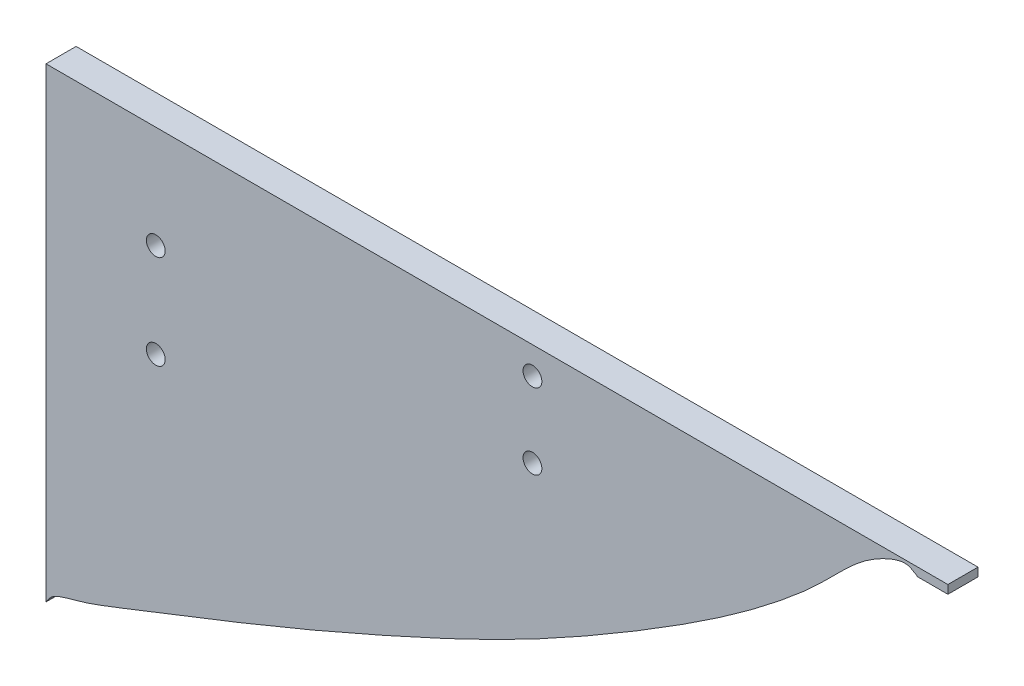
ISO-10303-21;
HEADER;
FILE_DESCRIPTION(('STEP AP214'),'2;1');
FILE_NAME('part.step','',(''),(''),'','','');
FILE_SCHEMA(('AUTOMOTIVE_DESIGN { 1 0 10303 214 1 1 1 1 }'));
ENDSEC;
DATA;
#1=APPLICATION_CONTEXT('core data for automotive mechanical design processes');
#2=APPLICATION_PROTOCOL_DEFINITION('international standard','automotive_design',2000,#1);
#3=PRODUCT_CONTEXT('',#1,'mechanical');
#4=PRODUCT('Part','Part','',(#3));
#5=PRODUCT_RELATED_PRODUCT_CATEGORY('part','',(#4));
#6=PRODUCT_DEFINITION_FORMATION('','',#4);
#7=PRODUCT_DEFINITION_CONTEXT('part definition',#1,'design');
#8=PRODUCT_DEFINITION('design','',#6,#7);
#9=PRODUCT_DEFINITION_SHAPE('','',#8);
#10=(LENGTH_UNIT() NAMED_UNIT(*) SI_UNIT(.MILLI.,.METRE.));
#11=(NAMED_UNIT(*) PLANE_ANGLE_UNIT() SI_UNIT($,.RADIAN.));
#12=(NAMED_UNIT(*) SI_UNIT($,.STERADIAN.) SOLID_ANGLE_UNIT());
#13=UNCERTAINTY_MEASURE_WITH_UNIT(LENGTH_MEASURE(1.E-05),#10,'distance_accuracy_value','');
#14=(GEOMETRIC_REPRESENTATION_CONTEXT(3) GLOBAL_UNCERTAINTY_ASSIGNED_CONTEXT((#13)) GLOBAL_UNIT_ASSIGNED_CONTEXT((#10,
#11,#12)) REPRESENTATION_CONTEXT('',''));
#15=CARTESIAN_POINT('',(0.,0.,0.));
#16=DIRECTION('',(0.,0.,1.));
#17=DIRECTION('',(1.,0.,0.));
#18=AXIS2_PLACEMENT_3D('',#15,#16,#17);
#19=CARTESIAN_POINT('',(-7.70807138526175,-69.5026230375403,128.));
#20=DIRECTION('',(0.,0.,1.));
#21=DIRECTION('',(1.,0.,0.));
#22=AXIS2_PLACEMENT_3D('',#19,#20,#21);
#23=PLANE('',#22);
#24=CARTESIAN_POINT('',(-100.,-50.,128.));
#25=DIRECTION('',(0.,0.,1.));
#26=DIRECTION('',(1.,0.,0.));
#27=AXIS2_PLACEMENT_3D('',#24,#25,#26);
#28=CIRCLE('',#27,2.5);
#29=CARTESIAN_POINT('',(-97.5,-50.,128.));
#30=VERTEX_POINT('',#29);
#31=EDGE_CURVE('E167',#30,#30,#28,.F.);
#32=ORIENTED_EDGE('',*,*,#31,.T.);
#33=EDGE_LOOP('',(#32));
#34=FACE_BOUND('',#33,.T.);
#35=CARTESIAN_POINT('',(0.0705666698621599,-4.96037406111782,128.));
#36=DIRECTION('',(0.,0.,1.));
#37=DIRECTION('',(1.,0.,0.));
#38=AXIS2_PLACEMENT_3D('',#35,#36,#37);
#39=CIRCLE('',#38,2.5);
#40=CARTESIAN_POINT('',(2.57056666986216,-4.96037406111782,128.));
#41=VERTEX_POINT('',#40);
#42=EDGE_CURVE('E163',#41,#41,#39,.F.);
#43=ORIENTED_EDGE('',*,*,#42,.T.);
#44=EDGE_LOOP('',(#43));
#45=FACE_BOUND('',#44,.T.);
#46=CARTESIAN_POINT('',(102.280212353996,0.000331053288811306,128.));
#47=CARTESIAN_POINT('',(102.231668562444,0.0835181476484817,128.));
#48=CARTESIAN_POINT('',(102.166846910566,0.158881318702934,128.));
#49=CARTESIAN_POINT('',(102.026472545439,0.284190307187531,128.));
#50=CARTESIAN_POINT('',(101.95008933932,0.336967348184515,128.));
#51=CARTESIAN_POINT('',(101.720620401155,0.480602441741828,128.));
#52=CARTESIAN_POINT('',(101.567364675611,0.560344081952438,128.));
#53=CARTESIAN_POINT('',(101.265250496466,0.722667471590911,128.));
#54=CARTESIAN_POINT('',(101.115234800415,0.807648272932703,128.));
#55=CARTESIAN_POINT('',(100.806862382081,0.971965590835073,128.));
#56=CARTESIAN_POINT('',(100.649671144083,1.04955082971557,128.));
#57=CARTESIAN_POINT('',(100.328187426773,1.19040797856271,128.));
#58=CARTESIAN_POINT('',(100.163130311974,1.25472820377746,128.));
#59=CARTESIAN_POINT('',(99.8211273649972,1.35550661933782,128.));
#60=CARTESIAN_POINT('',(99.6451258558719,1.39042580065534,128.));
#61=CARTESIAN_POINT('',(99.1156562394221,1.45401079885527,128.));
#62=CARTESIAN_POINT('',(98.760729773656,1.44216407020199,128.));
#63=CARTESIAN_POINT('',(98.0633829170569,1.36189087432004,128.));
#64=CARTESIAN_POINT('',(97.7204785706627,1.29395890820454,128.));
#65=CARTESIAN_POINT('',(97.0438500486515,1.13014332988084,128.));
#66=CARTESIAN_POINT('',(96.7092515776306,1.03465831597678,128.));
#67=CARTESIAN_POINT('',(95.71738063299,0.712015941394029,128.));
#68=CARTESIAN_POINT('',(95.0739046386271,0.450068265181077,128.));
#69=CARTESIAN_POINT('',(93.1760788497295,-0.397668471103113,128.));
#70=CARTESIAN_POINT('',(91.9527554331004,-1.052657453111,128.));
#71=CARTESIAN_POINT('',(89.5872671446015,-2.49250315788002,128.));
#72=CARTESIAN_POINT('',(88.446488594066,-3.28194822551894,128.));
#73=CARTESIAN_POINT('',(86.2669666230952,-4.98965427093458,128.));
#74=CARTESIAN_POINT('',(85.2265967950427,-5.90367124652182,128.));
#75=CARTESIAN_POINT('',(83.2044282705907,-7.78969259745291,128.));
#76=CARTESIAN_POINT('',(82.2222987713349,-8.76201820387607,128.));
#77=CARTESIAN_POINT('',(80.2721754047432,-10.7177912394779,128.));
#78=CARTESIAN_POINT('',(79.3022883175855,-11.6995083658145,128.));
#79=CARTESIAN_POINT('',(77.3408642005181,-13.6407297906605,128.));
#80=CARTESIAN_POINT('',(76.3516746151966,-14.6025988597127,128.));
#81=CARTESIAN_POINT('',(73.3396138336911,-17.4396066492514,128.));
#82=CARTESIAN_POINT('',(71.2687695726128,-19.2638296446281,128.));
#83=CARTESIAN_POINT('',(67.0478334359859,-22.8177965623035,128.));
#84=CARTESIAN_POINT('',(64.8982958664102,-24.5482573385447,128.));
#85=CARTESIAN_POINT('',(60.5443891990049,-27.938430012965,128.));
#86=CARTESIAN_POINT('',(58.3392552559529,-29.5969802367529,128.));
#87=CARTESIAN_POINT('',(53.8746634366044,-32.839205349649,128.));
#88=CARTESIAN_POINT('',(51.6159139517956,-34.4237745535297,128.));
#89=CARTESIAN_POINT('',(47.0584201335877,-37.5341348699885,128.));
#90=CARTESIAN_POINT('',(44.7597162465402,-39.0600355617683,128.));
#91=CARTESIAN_POINT('',(40.1349477450141,-42.0697040416021,128.));
#92=CARTESIAN_POINT('',(37.808738063545,-43.5531655506632,128.));
#93=CARTESIAN_POINT('',(30.7955396893987,-47.9482509989522,128.));
#94=CARTESIAN_POINT('',(26.0745201708403,-50.8050178667804,128.));
#95=CARTESIAN_POINT('',(16.5614401271219,-56.3970935223661,128.));
#96=CARTESIAN_POINT('',(11.7702293976102,-59.13393274831,128.));
#97=CARTESIAN_POINT('',(2.09923269016498,-64.4461033491582,128.));
#98=CARTESIAN_POINT('',(-2.78185912728635,-67.0189824787676,128.));
#99=CARTESIAN_POINT('',(-12.634283643237,-71.9862635963129,128.));
#100=CARTESIAN_POINT('',(-17.6048464936997,-74.3819284547952,128.));
#101=CARTESIAN_POINT('',(-27.5982239686284,-79.0621986895884,128.));
#102=CARTESIAN_POINT('',(-32.6200400495118,-81.3493677778145,128.));
#103=CARTESIAN_POINT('',(-42.6921942210025,-85.8610145208017,128.));
#104=CARTESIAN_POINT('',(-47.7438418244187,-88.0826605606909,128.));
#105=CARTESIAN_POINT('',(-57.8819907125996,-92.4469005717707,128.));
#106=CARTESIAN_POINT('',(-62.9692345416304,-94.5875107069509,128.));
#107=CARTESIAN_POINT('',(-73.1788398520799,-98.786400982152,128.));
#108=CARTESIAN_POINT('',(-78.3003478860893,-100.846497696208,128.));
#109=CARTESIAN_POINT('',(-88.5623748421011,-104.922562237776,128.));
#110=CARTESIAN_POINT('',(-93.7015554423704,-106.941999305314,128.));
#111=CARTESIAN_POINT('',(-101.414240543098,-109.963936284919,128.));
#112=CARTESIAN_POINT('',(-103.985761720037,-110.970055258458,128.));
#113=CARTESIAN_POINT('',(-107.847327322526,-112.46860376418,128.));
#114=CARTESIAN_POINT('',(-109.135305871131,-112.966206193555,128.));
#115=CARTESIAN_POINT('',(-111.712639134796,-113.958189202409,128.));
#116=CARTESIAN_POINT('',(-113.00108540103,-114.455488453429,128.));
#117=CARTESIAN_POINT('',(-115.583374346057,-115.432150394215,128.));
#118=CARTESIAN_POINT('',(-116.879034671292,-115.907311722204,128.));
#119=CARTESIAN_POINT('',(-118.842155720277,-116.561327546294,128.));
#120=CARTESIAN_POINT('',(-119.499551852248,-116.770075149092,128.));
#121=CARTESIAN_POINT('',(-120.820746986946,-117.166444057937,128.));
#122=CARTESIAN_POINT('',(-121.484393101503,-117.352812300754,128.));
#123=CARTESIAN_POINT('',(-122.818462959311,-117.707106510758,128.));
#124=CARTESIAN_POINT('',(-123.488640011785,-117.878065453409,128.));
#125=CARTESIAN_POINT('',(-124.485195243827,-118.17199685602,128.));
#126=CARTESIAN_POINT('',(-124.816044517357,-118.275779723012,128.));
#127=CARTESIAN_POINT('',(-125.471974260365,-118.502809992758,128.));
#128=CARTESIAN_POINT('',(-125.79751224795,-118.625364727787,128.));
#129=CARTESIAN_POINT('',(-126.436066254504,-118.905065721902,128.));
#130=CARTESIAN_POINT('',(-126.749498265083,-119.062523986958,128.));
#131=CARTESIAN_POINT('',(-127.346248608583,-119.431882173148,128.));
#132=CARTESIAN_POINT('',(-127.629921618326,-119.646344831918,128.));
#133=CARTESIAN_POINT('',(-128.13603437243,-120.136168336771,128.));
#134=CARTESIAN_POINT('',(-128.363344994072,-120.404127123299,128.));
#135=CARTESIAN_POINT('',(-128.678875791158,-120.821529100156,128.));
#136=CARTESIAN_POINT('',(-128.781274310812,-120.959257385186,128.));
#137=CARTESIAN_POINT('',(-128.932745508428,-121.172602011098,128.));
#138=CARTESIAN_POINT('',(-128.982310448335,-121.245263652877,128.));
#139=CARTESIAN_POINT('',(-129.076751965811,-121.396306998044,128.));
#140=CARTESIAN_POINT('',(-129.122574962392,-121.475376845054,128.));
#141=CARTESIAN_POINT('',(-129.159971318782,-121.560174765792,128.));
#142=B_SPLINE_CURVE_WITH_KNOTS('',3,(#46,#47,#48,#49,#50,#51,#52,#53,#54,#55,#56,#57,#58,#59,
#60,#61,#62,#63,#64,#65,#66,#67,#68,#69,#70,#71,#72,#73,#74,#75,#76,#77,#78,#79,#80,#81,#82,#83,
#84,#85,#86,#87,#88,#89,#90,#91,#92,#93,#94,#95,#96,#97,#98,#99,#100,#101,#102,#103,#104,#105,
#106,#107,#108,#109,#110,#111,#112,#113,#114,#115,#116,#117,#118,#119,#120,#121,#122,#123,#124,
#125,#126,#127,#128,#129,#130,#131,#132,#133,#134,#135,#136,#137,#138,#139,#140,#141),
.UNSPECIFIED.,.F.,.F.,(4,2,2,2,2,2,2,2,2,2,2,2,2,2,2,2,2,2,2,2,2,2,2,2,2,2,2,2,2,2,2,2,2,2,2,2,
2,2,2,2,2,2,2,2,2,2,2,4),(0.,0.000975271157240165,0.00195183365724017,0.00390495865724017,
0.00585808365724017,0.00781120865724005,0.00976433365724005,0.0117174586572401,
0.0156237086572401,0.0195299586572401,0.0234362086572399,0.0312487086572401,0.0468737086572402,
0.0624987086572402,0.0781237086572402,0.0937487086572402,0.10937370865724,0.12499870865724,
0.15624870865724,0.18749870865724,0.21874870865724,0.24999870865724,0.28124870865724,
0.31249870865724,0.37499870865724,0.43749870865724,0.49999870865724,0.56249870865724,
0.62499870865724,0.68749870865724,0.74999870865724,0.81249870865724,0.87499870865724,
0.90624870865724,0.92187370865724,0.93749870865724,0.95312370865724,0.96093620865724,
0.96874870865724,0.97656120865724,0.98046745865724,0.98437370865724,0.98827995865724,
0.99218620865724,0.99609245865724,0.99804558365724,0.99902214615724,0.99999870865724),.UNSPECIFIED.);
#143=CARTESIAN_POINT('',(-129.159971318782,-121.560174765792,128.));
#144=VERTEX_POINT('',#143);
#145=CARTESIAN_POINT('',(102.280215427349,0.000332846742458947,128.));
#146=VERTEX_POINT('',#145);
#147=EDGE_CURVE('E115',#144,#146,#142,.F.);
#148=ORIENTED_EDGE('',*,*,#147,.T.);
#149=DIRECTION('',(0.999999998292654,-5.84353747269663E-05,0.));
#150=VECTOR('',#149,1.);
#151=CARTESIAN_POINT('',(102.280215427349,0.000332846742458947,128.));
#152=LINE('',#151,#150);
#153=CARTESIAN_POINT('',(110.453711581712,-0.00014477456896611,128.));
#154=VERTEX_POINT('',#153);
#155=EDGE_CURVE('E85',#146,#154,#152,.T.);
#156=ORIENTED_EDGE('',*,*,#155,.T.);
#157=DIRECTION('',(0.,1.,0.));
#158=VECTOR('',#157,1.);
#159=CARTESIAN_POINT('',(110.453711581712,2.25600000000004,128.));
#160=LINE('',#159,#158);
#161=CARTESIAN_POINT('',(110.453711581712,2.25600000000004,128.));
#162=VERTEX_POINT('',#161);
#163=EDGE_CURVE('E89',#154,#162,#160,.T.);
#164=ORIENTED_EDGE('',*,*,#163,.T.);
#165=DIRECTION('',(-1.,0.,0.));
#166=VECTOR('',#165,1.);
#167=CARTESIAN_POINT('',(110.453711581712,2.25600000000004,128.));
#168=LINE('',#167,#166);
#169=CARTESIAN_POINT('',(-129.169335976339,2.25600000000001,128.));
#170=VERTEX_POINT('',#169);
#171=EDGE_CURVE('E93',#162,#170,#168,.T.);
#172=ORIENTED_EDGE('',*,*,#171,.T.);
#173=DIRECTION('',(7.56335555310563E-05,-0.999999997139783,0.));
#174=VECTOR('',#173,1.);
#175=CARTESIAN_POINT('',(-129.159971318782,-121.560174765792,128.));
#176=LINE('',#175,#174);
#177=EDGE_CURVE('E51',#170,#144,#176,.T.);
#178=ORIENTED_EDGE('',*,*,#177,.T.);
#179=EDGE_LOOP('',(#148,#156,#164,#172,#178));
#180=FACE_BOUND('',#179,.T.);
#181=CARTESIAN_POINT('',(0.0705666698621599,-25.,128.));
#182=DIRECTION('',(0.,0.,1.));
#183=DIRECTION('',(1.,0.,0.));
#184=AXIS2_PLACEMENT_3D('',#181,#182,#183);
#185=CIRCLE('',#184,2.5);
#186=CARTESIAN_POINT('',(2.57056666986216,-25.,128.));
#187=VERTEX_POINT('',#186);
#188=EDGE_CURVE('E164',#187,#187,#185,.F.);
#189=ORIENTED_EDGE('',*,*,#188,.T.);
#190=EDGE_LOOP('',(#189));
#191=FACE_BOUND('',#190,.T.);
#192=CARTESIAN_POINT('',(-100.,-25.,128.));
#193=DIRECTION('',(0.,0.,1.));
#194=DIRECTION('',(1.,0.,0.));
#195=AXIS2_PLACEMENT_3D('',#192,#193,#194);
#196=CIRCLE('',#195,2.5);
#197=CARTESIAN_POINT('',(-97.5,-25.,128.));
#198=VERTEX_POINT('',#197);
#199=EDGE_CURVE('E170',#198,#198,#196,.F.);
#200=ORIENTED_EDGE('',*,*,#199,.T.);
#201=EDGE_LOOP('',(#200));
#202=FACE_BOUND('',#201,.T.);
#203=ADVANCED_FACE('F30',(#34,#45,#180,#191,#202),#23,.T.);
#204=CARTESIAN_POINT('',(-7.70807138526175,-69.5026230375403,120.));
#205=DIRECTION('',(0.,0.,1.));
#206=DIRECTION('',(1.,0.,0.));
#207=AXIS2_PLACEMENT_3D('',#204,#205,#206);
#208=PLANE('',#207);
#209=CARTESIAN_POINT('',(-100.,-50.,120.));
#210=DIRECTION('',(0.,0.,1.));
#211=DIRECTION('',(1.,0.,0.));
#212=AXIS2_PLACEMENT_3D('',#209,#210,#211);
#213=CIRCLE('',#212,2.5);
#214=CARTESIAN_POINT('',(-97.5,-50.,120.));
#215=VERTEX_POINT('',#214);
#216=EDGE_CURVE('E168',#215,#215,#213,.F.);
#217=ORIENTED_EDGE('',*,*,#216,.F.);
#218=EDGE_LOOP('',(#217));
#219=FACE_BOUND('',#218,.T.);
#220=CARTESIAN_POINT('',(0.0705666698621599,-4.96037406111782,120.));
#221=DIRECTION('',(0.,0.,1.));
#222=DIRECTION('',(1.,0.,0.));
#223=AXIS2_PLACEMENT_3D('',#220,#221,#222);
#224=CIRCLE('',#223,2.5);
#225=CARTESIAN_POINT('',(2.57056666986216,-4.96037406111782,120.));
#226=VERTEX_POINT('',#225);
#227=EDGE_CURVE('E160',#226,#226,#224,.F.);
#228=ORIENTED_EDGE('',*,*,#227,.F.);
#229=EDGE_LOOP('',(#228));
#230=FACE_BOUND('',#229,.T.);
#231=CARTESIAN_POINT('',(-129.159971318782,-121.560174765792,120.));
#232=CARTESIAN_POINT('',(-129.122574962392,-121.475376845054,120.));
#233=CARTESIAN_POINT('',(-129.076751965811,-121.396306998044,120.));
#234=CARTESIAN_POINT('',(-128.982310448335,-121.245263652877,120.));
#235=CARTESIAN_POINT('',(-128.932745508428,-121.172602011098,120.));
#236=CARTESIAN_POINT('',(-128.781274310812,-120.959257385186,120.));
#237=CARTESIAN_POINT('',(-128.678875791158,-120.821529100156,120.));
#238=CARTESIAN_POINT('',(-128.363344994072,-120.404127123299,120.));
#239=CARTESIAN_POINT('',(-128.13603437243,-120.136168336771,120.));
#240=CARTESIAN_POINT('',(-127.629921618326,-119.646344831918,120.));
#241=CARTESIAN_POINT('',(-127.346248608583,-119.431882173148,120.));
#242=CARTESIAN_POINT('',(-126.749498265083,-119.062523986958,120.));
#243=CARTESIAN_POINT('',(-126.436066254504,-118.905065721902,120.));
#244=CARTESIAN_POINT('',(-125.79751224795,-118.625364727787,120.));
#245=CARTESIAN_POINT('',(-125.471974260365,-118.502809992758,120.));
#246=CARTESIAN_POINT('',(-124.816044517357,-118.275779723012,120.));
#247=CARTESIAN_POINT('',(-124.485195243827,-118.17199685602,120.));
#248=CARTESIAN_POINT('',(-123.488640011785,-117.878065453409,120.));
#249=CARTESIAN_POINT('',(-122.818462959311,-117.707106510758,120.));
#250=CARTESIAN_POINT('',(-121.484393101503,-117.352812300754,120.));
#251=CARTESIAN_POINT('',(-120.820746986946,-117.166444057937,120.));
#252=CARTESIAN_POINT('',(-119.499551852248,-116.770075149092,120.));
#253=CARTESIAN_POINT('',(-118.842155720277,-116.561327546294,120.));
#254=CARTESIAN_POINT('',(-116.879034671292,-115.907311722204,120.));
#255=CARTESIAN_POINT('',(-115.583374346057,-115.432150394215,120.));
#256=CARTESIAN_POINT('',(-113.00108540103,-114.455488453429,120.));
#257=CARTESIAN_POINT('',(-111.712639134796,-113.958189202409,120.));
#258=CARTESIAN_POINT('',(-109.135305871131,-112.966206193555,120.));
#259=CARTESIAN_POINT('',(-107.847327322526,-112.46860376418,120.));
#260=CARTESIAN_POINT('',(-103.985761720037,-110.970055258458,120.));
#261=CARTESIAN_POINT('',(-101.414240543098,-109.963936284919,120.));
#262=CARTESIAN_POINT('',(-93.7015554423704,-106.941999305314,120.));
#263=CARTESIAN_POINT('',(-88.5623748421011,-104.922562237776,120.));
#264=CARTESIAN_POINT('',(-78.3003478860893,-100.846497696208,120.));
#265=CARTESIAN_POINT('',(-73.1788398520799,-98.786400982152,120.));
#266=CARTESIAN_POINT('',(-62.9692345416304,-94.5875107069509,120.));
#267=CARTESIAN_POINT('',(-57.8819907125996,-92.4469005717707,120.));
#268=CARTESIAN_POINT('',(-47.7438418244187,-88.0826605606909,120.));
#269=CARTESIAN_POINT('',(-42.6921942210025,-85.8610145208017,120.));
#270=CARTESIAN_POINT('',(-32.6200400495118,-81.3493677778145,120.));
#271=CARTESIAN_POINT('',(-27.5982239686284,-79.0621986895884,120.));
#272=CARTESIAN_POINT('',(-17.6048464936997,-74.3819284547952,120.));
#273=CARTESIAN_POINT('',(-12.634283643237,-71.9862635963129,120.));
#274=CARTESIAN_POINT('',(-2.78185912728635,-67.0189824787676,120.));
#275=CARTESIAN_POINT('',(2.09923269016498,-64.4461033491582,120.));
#276=CARTESIAN_POINT('',(11.7702293976102,-59.13393274831,120.));
#277=CARTESIAN_POINT('',(16.5614401271219,-56.3970935223661,120.));
#278=CARTESIAN_POINT('',(26.0745201708403,-50.8050178667804,120.));
#279=CARTESIAN_POINT('',(30.7955396893987,-47.9482509989522,120.));
#280=CARTESIAN_POINT('',(37.808738063545,-43.5531655506632,120.));
#281=CARTESIAN_POINT('',(40.1349477450141,-42.0697040416021,120.));
#282=CARTESIAN_POINT('',(44.7597162465402,-39.0600355617683,120.));
#283=CARTESIAN_POINT('',(47.0584201335877,-37.5341348699885,120.));
#284=CARTESIAN_POINT('',(51.6159139517956,-34.4237745535297,120.));
#285=CARTESIAN_POINT('',(53.8746634366044,-32.839205349649,120.));
#286=CARTESIAN_POINT('',(58.3392552559529,-29.5969802367529,120.));
#287=CARTESIAN_POINT('',(60.5443891990049,-27.938430012965,120.));
#288=CARTESIAN_POINT('',(64.8982958664102,-24.5482573385447,120.));
#289=CARTESIAN_POINT('',(67.0478334359859,-22.8177965623035,120.));
#290=CARTESIAN_POINT('',(71.2687695726128,-19.2638296446281,120.));
#291=CARTESIAN_POINT('',(73.3396138336911,-17.4396066492514,120.));
#292=CARTESIAN_POINT('',(76.3516746151966,-14.6025988597127,120.));
#293=CARTESIAN_POINT('',(77.3408642005181,-13.6407297906605,120.));
#294=CARTESIAN_POINT('',(79.3022883175855,-11.6995083658145,120.));
#295=CARTESIAN_POINT('',(80.2721754047432,-10.7177912394779,120.));
#296=CARTESIAN_POINT('',(82.2222987713349,-8.76201820387607,120.));
#297=CARTESIAN_POINT('',(83.2044282705907,-7.78969259745291,120.));
#298=CARTESIAN_POINT('',(85.2265967950427,-5.90367124652182,120.));
#299=CARTESIAN_POINT('',(86.2669666230952,-4.98965427093458,120.));
#300=CARTESIAN_POINT('',(88.446488594066,-3.28194822551894,120.));
#301=CARTESIAN_POINT('',(89.5872671446015,-2.49250315788002,120.));
#302=CARTESIAN_POINT('',(91.9527554331004,-1.052657453111,120.));
#303=CARTESIAN_POINT('',(93.1760788497295,-0.397668471103113,120.));
#304=CARTESIAN_POINT('',(95.0739046386271,0.450068265181077,120.));
#305=CARTESIAN_POINT('',(95.71738063299,0.712015941394029,120.));
#306=CARTESIAN_POINT('',(96.7092515776306,1.03465831597678,120.));
#307=CARTESIAN_POINT('',(97.0438500486515,1.13014332988084,120.));
#308=CARTESIAN_POINT('',(97.7204785706627,1.29395890820454,120.));
#309=CARTESIAN_POINT('',(98.0633829170569,1.36189087432004,120.));
#310=CARTESIAN_POINT('',(98.760729773656,1.44216407020199,120.));
#311=CARTESIAN_POINT('',(99.1156562394221,1.45401079885527,120.));
#312=CARTESIAN_POINT('',(99.6451258558719,1.39042580065534,120.));
#313=CARTESIAN_POINT('',(99.8211273649972,1.35550661933782,120.));
#314=CARTESIAN_POINT('',(100.163130311974,1.25472820377746,120.));
#315=CARTESIAN_POINT('',(100.328187426773,1.19040797856271,120.));
#316=CARTESIAN_POINT('',(100.649671144083,1.04955082971557,120.));
#317=CARTESIAN_POINT('',(100.806862382081,0.971965590835073,120.));
#318=CARTESIAN_POINT('',(101.115234800415,0.807648272932703,120.));
#319=CARTESIAN_POINT('',(101.265250496466,0.722667471590911,120.));
#320=CARTESIAN_POINT('',(101.567364675611,0.560344081952438,120.));
#321=CARTESIAN_POINT('',(101.720620401155,0.480602441741828,120.));
#322=CARTESIAN_POINT('',(101.95008933932,0.336967348184515,120.));
#323=CARTESIAN_POINT('',(102.026472545439,0.284190307187531,120.));
#324=CARTESIAN_POINT('',(102.166939782938,0.158798413659043,120.));
#325=CARTESIAN_POINT('',(102.231840211986,0.0833185506749162,120.));
#326=CARTESIAN_POINT('',(102.280405096801,5.71580551064679E-07,120.));
#327=B_SPLINE_CURVE_WITH_KNOTS('',3,(#231,#232,#233,#234,#235,#236,#237,#238,#239,#240,#241,
#242,#243,#244,#245,#246,#247,#248,#249,#250,#251,#252,#253,#254,#255,#256,#257,#258,#259,#260,
#261,#262,#263,#264,#265,#266,#267,#268,#269,#270,#271,#272,#273,#274,#275,#276,#277,#278,#279,
#280,#281,#282,#283,#284,#285,#286,#287,#288,#289,#290,#291,#292,#293,#294,#295,#296,#297,#298,
#299,#300,#301,#302,#303,#304,#305,#306,#307,#308,#309,#310,#311,#312,#313,#314,#315,#316,#317,
#318,#319,#320,#321,#322,#323,#324,#325,#326),.UNSPECIFIED.,.F.,.F.,(4,2,2,2,2,2,2,2,2,2,2,2,2,
2,2,2,2,2,2,2,2,2,2,2,2,2,2,2,2,2,2,2,2,2,2,2,2,2,2,2,2,2,2,2,2,2,2,4),(0.,0.000976562500000111,
0.00195312500000022,0.00390625000000033,0.00781250000000022,0.0117187500000002,
0.0156250000000002,0.0195312500000002,0.0234375000000002,0.0312500000000003,0.0390625000000003,
0.0468750000000004,0.0625000000000004,0.0781250000000004,0.0937500000000004,0.125,0.1875,0.25,
0.3125,0.375,0.4375,0.5,0.5625,0.625,0.6875,0.71875,0.75,0.78125,0.8125,0.84375,0.875,0.890625,
0.90625,0.921875,0.9375,0.953125,0.96875,0.9765625,0.98046875,0.984375,0.98828125,0.990234375,
0.9921875,0.994140625,0.99609375,0.998046875,0.9990234375,1.),.UNSPECIFIED.);
#328=CARTESIAN_POINT('',(-129.159971318782,-121.560174765792,120.));
#329=VERTEX_POINT('',#328);
#330=CARTESIAN_POINT('',(102.280215427349,0.000332846742458947,120.));
#331=VERTEX_POINT('',#330);
#332=EDGE_CURVE('E157',#329,#331,#327,.T.);
#333=ORIENTED_EDGE('',*,*,#332,.F.);
#334=DIRECTION('',(7.56335555310563E-05,-0.999999997139783,0.));
#335=VECTOR('',#334,1.);
#336=CARTESIAN_POINT('',(-129.159971318782,-121.560174765792,120.));
#337=LINE('',#336,#335);
#338=CARTESIAN_POINT('',(-129.169335976339,2.25600000000001,120.));
#339=VERTEX_POINT('',#338);
#340=EDGE_CURVE('E77',#339,#329,#337,.T.);
#341=ORIENTED_EDGE('',*,*,#340,.F.);
#342=DIRECTION('',(-1.,0.,0.));
#343=VECTOR('',#342,1.);
#344=CARTESIAN_POINT('',(110.453711581712,2.25600000000004,120.));
#345=LINE('',#344,#343);
#346=CARTESIAN_POINT('',(110.453711581712,2.25600000000004,120.));
#347=VERTEX_POINT('',#346);
#348=EDGE_CURVE('E71',#347,#339,#345,.T.);
#349=ORIENTED_EDGE('',*,*,#348,.F.);
#350=DIRECTION('',(0.,1.,0.));
#351=VECTOR('',#350,1.);
#352=CARTESIAN_POINT('',(110.453711581712,2.25600000000004,120.));
#353=LINE('',#352,#351);
#354=CARTESIAN_POINT('',(110.453711581712,-0.00014477456896611,120.));
#355=VERTEX_POINT('',#354);
#356=EDGE_CURVE('E100',#355,#347,#353,.T.);
#357=ORIENTED_EDGE('',*,*,#356,.F.);
#358=DIRECTION('',(0.999999998292654,-5.84353747269663E-05,0.));
#359=VECTOR('',#358,1.);
#360=CARTESIAN_POINT('',(102.280215427349,0.000332846742458947,120.));
#361=LINE('',#360,#359);
#362=EDGE_CURVE('E109',#331,#355,#361,.T.);
#363=ORIENTED_EDGE('',*,*,#362,.F.);
#364=EDGE_LOOP('',(#333,#341,#349,#357,#363));
#365=FACE_BOUND('',#364,.T.);
#366=CARTESIAN_POINT('',(0.0705666698621599,-25.,120.));
#367=DIRECTION('',(0.,0.,1.));
#368=DIRECTION('',(1.,0.,0.));
#369=AXIS2_PLACEMENT_3D('',#366,#367,#368);
#370=CIRCLE('',#369,2.5);
#371=CARTESIAN_POINT('',(2.57056666986216,-25.,120.));
#372=VERTEX_POINT('',#371);
#373=EDGE_CURVE('E165',#372,#372,#370,.F.);
#374=ORIENTED_EDGE('',*,*,#373,.F.);
#375=EDGE_LOOP('',(#374));
#376=FACE_BOUND('',#375,.T.);
#377=CARTESIAN_POINT('',(-100.,-25.,120.));
#378=DIRECTION('',(0.,0.,1.));
#379=DIRECTION('',(1.,0.,0.));
#380=AXIS2_PLACEMENT_3D('',#377,#378,#379);
#381=CIRCLE('',#380,2.5);
#382=CARTESIAN_POINT('',(-97.5,-25.,120.));
#383=VERTEX_POINT('',#382);
#384=EDGE_CURVE('E36',#383,#383,#381,.F.);
#385=ORIENTED_EDGE('',*,*,#384,.F.);
#386=EDGE_LOOP('',(#385));
#387=FACE_BOUND('',#386,.T.);
#388=ADVANCED_FACE('F131',(#219,#230,#365,#376,#387),#208,.F.);
#389=CARTESIAN_POINT('',(-129.159971318782,-121.560174765792,128.));
#390=CARTESIAN_POINT('',(-129.122574962392,-121.475376845054,128.));
#391=CARTESIAN_POINT('',(-129.076751965811,-121.396306998044,128.));
#392=CARTESIAN_POINT('',(-128.982310448335,-121.245263652877,128.));
#393=CARTESIAN_POINT('',(-128.932745508428,-121.172602011098,128.));
#394=CARTESIAN_POINT('',(-128.781274310812,-120.959257385186,128.));
#395=CARTESIAN_POINT('',(-128.678875791158,-120.821529100156,128.));
#396=CARTESIAN_POINT('',(-128.363344994072,-120.404127123299,128.));
#397=CARTESIAN_POINT('',(-128.13603437243,-120.136168336771,128.));
#398=CARTESIAN_POINT('',(-127.629921618326,-119.646344831918,128.));
#399=CARTESIAN_POINT('',(-127.346248608583,-119.431882173148,128.));
#400=CARTESIAN_POINT('',(-126.749498265083,-119.062523986958,128.));
#401=CARTESIAN_POINT('',(-126.436066254504,-118.905065721902,128.));
#402=CARTESIAN_POINT('',(-125.79751224795,-118.625364727787,128.));
#403=CARTESIAN_POINT('',(-125.471974260365,-118.502809992758,128.));
#404=CARTESIAN_POINT('',(-124.816044517357,-118.275779723012,128.));
#405=CARTESIAN_POINT('',(-124.485195243827,-118.17199685602,128.));
#406=CARTESIAN_POINT('',(-123.488640011785,-117.878065453409,128.));
#407=CARTESIAN_POINT('',(-122.818462959311,-117.707106510758,128.));
#408=CARTESIAN_POINT('',(-121.484393101503,-117.352812300754,128.));
#409=CARTESIAN_POINT('',(-120.820746986946,-117.166444057937,128.));
#410=CARTESIAN_POINT('',(-119.499551852248,-116.770075149092,128.));
#411=CARTESIAN_POINT('',(-118.842155720277,-116.561327546294,128.));
#412=CARTESIAN_POINT('',(-116.879034671292,-115.907311722204,128.));
#413=CARTESIAN_POINT('',(-115.583374346057,-115.432150394215,128.));
#414=CARTESIAN_POINT('',(-113.00108540103,-114.455488453429,128.));
#415=CARTESIAN_POINT('',(-111.712639134796,-113.958189202409,128.));
#416=CARTESIAN_POINT('',(-109.135305871131,-112.966206193555,128.));
#417=CARTESIAN_POINT('',(-107.847327322526,-112.46860376418,128.));
#418=CARTESIAN_POINT('',(-103.985761720037,-110.970055258458,128.));
#419=CARTESIAN_POINT('',(-101.414240543098,-109.963936284919,128.));
#420=CARTESIAN_POINT('',(-93.7015554423704,-106.941999305314,128.));
#421=CARTESIAN_POINT('',(-88.5623748421011,-104.922562237776,128.));
#422=CARTESIAN_POINT('',(-78.3003478860893,-100.846497696208,128.));
#423=CARTESIAN_POINT('',(-73.1788398520799,-98.786400982152,128.));
#424=CARTESIAN_POINT('',(-62.9692345416304,-94.5875107069509,128.));
#425=CARTESIAN_POINT('',(-57.8819907125996,-92.4469005717707,128.));
#426=CARTESIAN_POINT('',(-47.7438418244187,-88.0826605606909,128.));
#427=CARTESIAN_POINT('',(-42.6921942210025,-85.8610145208017,128.));
#428=CARTESIAN_POINT('',(-32.6200400495118,-81.3493677778145,128.));
#429=CARTESIAN_POINT('',(-27.5982239686284,-79.0621986895884,128.));
#430=CARTESIAN_POINT('',(-17.6048464936997,-74.3819284547952,128.));
#431=CARTESIAN_POINT('',(-12.634283643237,-71.9862635963129,128.));
#432=CARTESIAN_POINT('',(-2.78185912728635,-67.0189824787676,128.));
#433=CARTESIAN_POINT('',(2.09923269016498,-64.4461033491582,128.));
#434=CARTESIAN_POINT('',(11.7702293976102,-59.13393274831,128.));
#435=CARTESIAN_POINT('',(16.5614401271219,-56.3970935223661,128.));
#436=CARTESIAN_POINT('',(26.0745201708403,-50.8050178667804,128.));
#437=CARTESIAN_POINT('',(30.7955396893987,-47.9482509989522,128.));
#438=CARTESIAN_POINT('',(37.808738063545,-43.5531655506632,128.));
#439=CARTESIAN_POINT('',(40.1349477450141,-42.0697040416021,128.));
#440=CARTESIAN_POINT('',(44.7597162465402,-39.0600355617683,128.));
#441=CARTESIAN_POINT('',(47.0584201335877,-37.5341348699885,128.));
#442=CARTESIAN_POINT('',(51.6159139517956,-34.4237745535297,128.));
#443=CARTESIAN_POINT('',(53.8746634366044,-32.839205349649,128.));
#444=CARTESIAN_POINT('',(58.3392552559529,-29.5969802367529,128.));
#445=CARTESIAN_POINT('',(60.5443891990049,-27.938430012965,128.));
#446=CARTESIAN_POINT('',(64.8982958664102,-24.5482573385447,128.));
#447=CARTESIAN_POINT('',(67.0478334359859,-22.8177965623035,128.));
#448=CARTESIAN_POINT('',(71.2687695726128,-19.2638296446281,128.));
#449=CARTESIAN_POINT('',(73.3396138336911,-17.4396066492514,128.));
#450=CARTESIAN_POINT('',(76.3516746151966,-14.6025988597127,128.));
#451=CARTESIAN_POINT('',(77.3408642005181,-13.6407297906605,128.));
#452=CARTESIAN_POINT('',(79.3022883175855,-11.6995083658145,128.));
#453=CARTESIAN_POINT('',(80.2721754047432,-10.7177912394779,128.));
#454=CARTESIAN_POINT('',(82.2222987713349,-8.76201820387607,128.));
#455=CARTESIAN_POINT('',(83.2044282705907,-7.78969259745291,128.));
#456=CARTESIAN_POINT('',(85.2265967950427,-5.90367124652182,128.));
#457=CARTESIAN_POINT('',(86.2669666230952,-4.98965427093458,128.));
#458=CARTESIAN_POINT('',(88.446488594066,-3.28194822551894,128.));
#459=CARTESIAN_POINT('',(89.5872671446015,-2.49250315788002,128.));
#460=CARTESIAN_POINT('',(91.9527554331004,-1.052657453111,128.));
#461=CARTESIAN_POINT('',(93.1760788497295,-0.397668471103113,128.));
#462=CARTESIAN_POINT('',(95.0739046386271,0.450068265181077,128.));
#463=CARTESIAN_POINT('',(95.71738063299,0.712015941394029,128.));
#464=CARTESIAN_POINT('',(96.7092515776306,1.03465831597678,128.));
#465=CARTESIAN_POINT('',(97.0438500486515,1.13014332988084,128.));
#466=CARTESIAN_POINT('',(97.7204785706627,1.29395890820454,128.));
#467=CARTESIAN_POINT('',(98.0633829170569,1.36189087432004,128.));
#468=CARTESIAN_POINT('',(98.760729773656,1.44216407020199,128.));
#469=CARTESIAN_POINT('',(99.1156562394221,1.45401079885527,128.));
#470=CARTESIAN_POINT('',(99.6451258558719,1.39042580065534,128.));
#471=CARTESIAN_POINT('',(99.8211273649972,1.35550661933782,128.));
#472=CARTESIAN_POINT('',(100.163130311974,1.25472820377746,128.));
#473=CARTESIAN_POINT('',(100.328187426773,1.19040797856271,128.));
#474=CARTESIAN_POINT('',(100.649671144083,1.04955082971557,128.));
#475=CARTESIAN_POINT('',(100.806862382081,0.971965590835073,128.));
#476=CARTESIAN_POINT('',(101.115234800415,0.807648272932703,128.));
#477=CARTESIAN_POINT('',(101.265250496466,0.722667471590911,128.));
#478=CARTESIAN_POINT('',(101.567364675611,0.560344081952438,128.));
#479=CARTESIAN_POINT('',(101.720620401155,0.480602441741828,128.));
#480=CARTESIAN_POINT('',(101.95008933932,0.336967348184515,128.));
#481=CARTESIAN_POINT('',(102.026472545439,0.284190307187531,128.));
#482=CARTESIAN_POINT('',(102.166939782938,0.158798413659043,128.));
#483=CARTESIAN_POINT('',(102.231840211986,0.0833185506749162,128.));
#484=CARTESIAN_POINT('',(102.280405096801,5.71580551064679E-07,128.));
#485=B_SPLINE_CURVE_WITH_KNOTS('',3,(#389,#390,#391,#392,#393,#394,#395,#396,#397,#398,#399,
#400,#401,#402,#403,#404,#405,#406,#407,#408,#409,#410,#411,#412,#413,#414,#415,#416,#417,#418,
#419,#420,#421,#422,#423,#424,#425,#426,#427,#428,#429,#430,#431,#432,#433,#434,#435,#436,#437,
#438,#439,#440,#441,#442,#443,#444,#445,#446,#447,#448,#449,#450,#451,#452,#453,#454,#455,#456,
#457,#458,#459,#460,#461,#462,#463,#464,#465,#466,#467,#468,#469,#470,#471,#472,#473,#474,#475,
#476,#477,#478,#479,#480,#481,#482,#483,#484),.UNSPECIFIED.,.F.,.F.,(4,2,2,2,2,2,2,2,2,2,2,2,2,
2,2,2,2,2,2,2,2,2,2,2,2,2,2,2,2,2,2,2,2,2,2,2,2,2,2,2,2,2,2,2,2,2,2,4),(0.,0.000976562500000111,
0.00195312500000022,0.00390625000000033,0.00781250000000022,0.0117187500000002,
0.0156250000000002,0.0195312500000002,0.0234375000000002,0.0312500000000003,0.0390625000000003,
0.0468750000000004,0.0625000000000004,0.0781250000000004,0.0937500000000004,0.125,0.1875,0.25,
0.3125,0.375,0.4375,0.5,0.5625,0.625,0.6875,0.71875,0.75,0.78125,0.8125,0.84375,0.875,0.890625,
0.90625,0.921875,0.9375,0.953125,0.96875,0.9765625,0.98046875,0.984375,0.98828125,0.990234375,
0.9921875,0.994140625,0.99609375,0.998046875,0.9990234375,1.),.UNSPECIFIED.);
#486=DIRECTION('',(0.,0.,-1.));
#487=VECTOR('',#486,1.);
#488=SURFACE_OF_LINEAR_EXTRUSION('',#485,#487);
#489=ORIENTED_EDGE('',*,*,#332,.T.);
#490=DIRECTION('',(0.,0.,-1.));
#491=VECTOR('',#490,1.);
#492=CARTESIAN_POINT('',(102.280215427349,0.000332846742458947,128.));
#493=LINE('',#492,#491);
#494=EDGE_CURVE('E11',#146,#331,#493,.T.);
#495=ORIENTED_EDGE('',*,*,#494,.F.);
#496=ORIENTED_EDGE('',*,*,#147,.F.);
#497=DIRECTION('',(0.,0.,-1.));
#498=VECTOR('',#497,1.);
#499=CARTESIAN_POINT('',(-129.159971318782,-121.560174765792,128.));
#500=LINE('',#499,#498);
#501=EDGE_CURVE('E105',#144,#329,#500,.T.);
#502=ORIENTED_EDGE('',*,*,#501,.T.);
#503=EDGE_LOOP('',(#489,#495,#496,#502));
#504=FACE_BOUND('',#503,.T.);
#505=ADVANCED_FACE('F32',(#504),#488,.F.);
#506=CARTESIAN_POINT('',(102.280215427349,0.000332846742458947,128.));
#507=DIRECTION('',(5.84353747269663E-05,0.999999998292654,0.));
#508=DIRECTION('',(-0.999999998292654,5.84353747269663E-05,0.));
#509=AXIS2_PLACEMENT_3D('',#506,#507,#508);
#510=PLANE('',#509);
#511=ORIENTED_EDGE('',*,*,#362,.T.);
#512=DIRECTION('',(0.,0.,-1.));
#513=VECTOR('',#512,1.);
#514=CARTESIAN_POINT('',(110.453711581712,-0.00014477456896611,128.));
#515=LINE('',#514,#513);
#516=EDGE_CURVE('E42',#154,#355,#515,.T.);
#517=ORIENTED_EDGE('',*,*,#516,.F.);
#518=ORIENTED_EDGE('',*,*,#155,.F.);
#519=ORIENTED_EDGE('',*,*,#494,.T.);
#520=EDGE_LOOP('',(#511,#517,#518,#519));
#521=FACE_BOUND('',#520,.T.);
#522=ADVANCED_FACE('F221',(#521),#510,.F.);
#523=CARTESIAN_POINT('',(110.453711581712,2.25600000000004,128.));
#524=DIRECTION('',(-1.,0.,0.));
#525=DIRECTION('',(0.,-1.,0.));
#526=AXIS2_PLACEMENT_3D('',#523,#524,#525);
#527=PLANE('',#526);
#528=ORIENTED_EDGE('',*,*,#356,.T.);
#529=DIRECTION('',(0.,0.,-1.));
#530=VECTOR('',#529,1.);
#531=CARTESIAN_POINT('',(110.453711581712,2.25600000000004,128.));
#532=LINE('',#531,#530);
#533=EDGE_CURVE('E97',#162,#347,#532,.T.);
#534=ORIENTED_EDGE('',*,*,#533,.F.);
#535=ORIENTED_EDGE('',*,*,#163,.F.);
#536=ORIENTED_EDGE('',*,*,#516,.T.);
#537=EDGE_LOOP('',(#528,#534,#535,#536));
#538=FACE_BOUND('',#537,.T.);
#539=ADVANCED_FACE('F98',(#538),#527,.F.);
#540=CARTESIAN_POINT('',(110.453711581712,2.25600000000004,128.));
#541=DIRECTION('',(0.,-1.,0.));
#542=DIRECTION('',(1.,0.,0.));
#543=AXIS2_PLACEMENT_3D('',#540,#541,#542);
#544=PLANE('',#543);
#545=ORIENTED_EDGE('',*,*,#348,.T.);
#546=DIRECTION('',(0.,0.,-1.));
#547=VECTOR('',#546,1.);
#548=CARTESIAN_POINT('',(-129.169335976339,2.25600000000001,128.));
#549=LINE('',#548,#547);
#550=EDGE_CURVE('E101',#170,#339,#549,.T.);
#551=ORIENTED_EDGE('',*,*,#550,.F.);
#552=ORIENTED_EDGE('',*,*,#171,.F.);
#553=ORIENTED_EDGE('',*,*,#533,.T.);
#554=EDGE_LOOP('',(#545,#551,#552,#553));
#555=FACE_BOUND('',#554,.T.);
#556=ADVANCED_FACE('F103',(#555),#544,.F.);
#557=CARTESIAN_POINT('',(-129.159971318782,-121.560174765792,128.));
#558=DIRECTION('',(0.999999997139783,7.56335555310563E-05,0.));
#559=DIRECTION('',(-7.56335555310563E-05,0.999999997139783,0.));
#560=AXIS2_PLACEMENT_3D('',#557,#558,#559);
#561=PLANE('',#560);
#562=ORIENTED_EDGE('',*,*,#340,.T.);
#563=ORIENTED_EDGE('',*,*,#501,.F.);
#564=ORIENTED_EDGE('',*,*,#177,.F.);
#565=ORIENTED_EDGE('',*,*,#550,.T.);
#566=EDGE_LOOP('',(#562,#563,#564,#565));
#567=FACE_BOUND('',#566,.T.);
#568=ADVANCED_FACE('F139',(#567),#561,.F.);
#569=CARTESIAN_POINT('',(0.0705666698621599,-4.96037406111782,308.));
#570=DIRECTION('',(0.,0.,-1.));
#571=DIRECTION('',(-1.,0.,0.));
#572=AXIS2_PLACEMENT_3D('',#569,#570,#571);
#573=CYLINDRICAL_SURFACE('',#572,2.5);
#574=ORIENTED_EDGE('',*,*,#42,.F.);
#575=EDGE_LOOP('',(#574));
#576=FACE_BOUND('',#575,.T.);
#577=ORIENTED_EDGE('',*,*,#227,.T.);
#578=EDGE_LOOP('',(#577));
#579=FACE_BOUND('',#578,.T.);
#580=ADVANCED_FACE('F133',(#576,#579),#573,.F.);
#581=CARTESIAN_POINT('',(0.0705666698621599,-25.,308.));
#582=DIRECTION('',(0.,0.,-1.));
#583=DIRECTION('',(-1.,0.,0.));
#584=AXIS2_PLACEMENT_3D('',#581,#582,#583);
#585=CYLINDRICAL_SURFACE('',#584,2.5);
#586=ORIENTED_EDGE('',*,*,#188,.F.);
#587=EDGE_LOOP('',(#586));
#588=FACE_BOUND('',#587,.T.);
#589=ORIENTED_EDGE('',*,*,#373,.T.);
#590=EDGE_LOOP('',(#589));
#591=FACE_BOUND('',#590,.T.);
#592=ADVANCED_FACE('F235',(#588,#591),#585,.F.);
#593=CARTESIAN_POINT('',(-100.,-50.,308.));
#594=DIRECTION('',(0.,0.,-1.));
#595=DIRECTION('',(-1.,0.,0.));
#596=AXIS2_PLACEMENT_3D('',#593,#594,#595);
#597=CYLINDRICAL_SURFACE('',#596,2.5);
#598=ORIENTED_EDGE('',*,*,#31,.F.);
#599=EDGE_LOOP('',(#598));
#600=FACE_BOUND('',#599,.T.);
#601=ORIENTED_EDGE('',*,*,#216,.T.);
#602=EDGE_LOOP('',(#601));
#603=FACE_BOUND('',#602,.T.);
#604=ADVANCED_FACE('F240',(#600,#603),#597,.F.);
#605=CARTESIAN_POINT('',(-100.,-25.,308.));
#606=DIRECTION('',(0.,0.,-1.));
#607=DIRECTION('',(-1.,0.,0.));
#608=AXIS2_PLACEMENT_3D('',#605,#606,#607);
#609=CYLINDRICAL_SURFACE('',#608,2.5);
#610=ORIENTED_EDGE('',*,*,#199,.F.);
#611=EDGE_LOOP('',(#610));
#612=FACE_BOUND('',#611,.T.);
#613=ORIENTED_EDGE('',*,*,#384,.T.);
#614=EDGE_LOOP('',(#613));
#615=FACE_BOUND('',#614,.T.);
#616=ADVANCED_FACE('F248',(#612,#615),#609,.F.);
#617=CLOSED_SHELL('',(#203,#388,#505,#522,#539,#556,#568,#580,#592,#604,#616));
#618=MANIFOLD_SOLID_BREP('B2',#617);
#619=ADVANCED_BREP_SHAPE_REPRESENTATION('',(#18,#618),#14);
#620=SHAPE_DEFINITION_REPRESENTATION(#9,#619);
ENDSEC;
END-ISO-10303-21;
